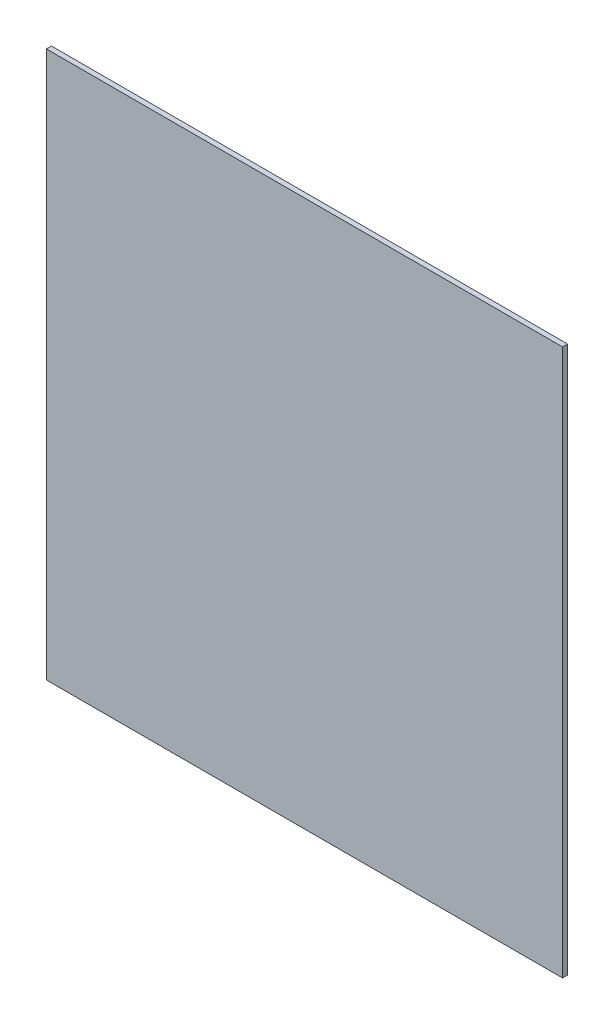
ISO-10303-21;
HEADER;
FILE_DESCRIPTION(('STEP AP214'),'2;1');
FILE_NAME('part.step','',(''),(''),'','','');
FILE_SCHEMA(('AUTOMOTIVE_DESIGN { 1 0 10303 214 1 1 1 1 }'));
ENDSEC;
DATA;
#1=APPLICATION_CONTEXT('core data for automotive mechanical design processes');
#2=APPLICATION_PROTOCOL_DEFINITION('international standard','automotive_design',2000,#1);
#3=PRODUCT_CONTEXT('',#1,'mechanical');
#4=PRODUCT('Part','Part','',(#3));
#5=PRODUCT_RELATED_PRODUCT_CATEGORY('part','',(#4));
#6=PRODUCT_DEFINITION_FORMATION('','',#4);
#7=PRODUCT_DEFINITION_CONTEXT('part definition',#1,'design');
#8=PRODUCT_DEFINITION('design','',#6,#7);
#9=PRODUCT_DEFINITION_SHAPE('','',#8);
#10=(LENGTH_UNIT() NAMED_UNIT(*) SI_UNIT(.MILLI.,.METRE.));
#11=(NAMED_UNIT(*) PLANE_ANGLE_UNIT() SI_UNIT($,.RADIAN.));
#12=(NAMED_UNIT(*) SI_UNIT($,.STERADIAN.) SOLID_ANGLE_UNIT());
#13=UNCERTAINTY_MEASURE_WITH_UNIT(LENGTH_MEASURE(1.E-05),#10,'distance_accuracy_value','');
#14=(GEOMETRIC_REPRESENTATION_CONTEXT(3) GLOBAL_UNCERTAINTY_ASSIGNED_CONTEXT((#13)) GLOBAL_UNIT_ASSIGNED_CONTEXT((#10,
#11,#12)) REPRESENTATION_CONTEXT('',''));
#15=CARTESIAN_POINT('',(0.,0.,0.));
#16=DIRECTION('',(0.,0.,1.));
#17=DIRECTION('',(1.,0.,0.));
#18=AXIS2_PLACEMENT_3D('',#15,#16,#17);
#19=CARTESIAN_POINT('',(606.,648.,6.));
#20=DIRECTION('',(-1.,0.,0.));
#21=DIRECTION('',(0.,0.,1.));
#22=AXIS2_PLACEMENT_3D('',#19,#20,#21);
#23=PLANE('',#22);
#24=DIRECTION('',(0.,1.,0.));
#25=VECTOR('',#24,1.);
#26=CARTESIAN_POINT('',(606.,648.,0.));
#27=LINE('',#26,#25);
#28=CARTESIAN_POINT('',(606.,0.,0.));
#29=VERTEX_POINT('',#28);
#30=CARTESIAN_POINT('',(606.,648.,0.));
#31=VERTEX_POINT('',#30);
#32=EDGE_CURVE('E96',#29,#31,#27,.T.);
#33=ORIENTED_EDGE('',*,*,#32,.T.);
#34=DIRECTION('',(0.,0.,-1.));
#35=VECTOR('',#34,1.);
#36=CARTESIAN_POINT('',(606.,648.,6.));
#37=LINE('',#36,#35);
#38=CARTESIAN_POINT('',(606.,648.,6.));
#39=VERTEX_POINT('',#38);
#40=EDGE_CURVE('E11',#39,#31,#37,.T.);
#41=ORIENTED_EDGE('',*,*,#40,.F.);
#42=DIRECTION('',(0.,1.,0.));
#43=VECTOR('',#42,1.);
#44=CARTESIAN_POINT('',(606.,648.,6.));
#45=LINE('',#44,#43);
#46=CARTESIAN_POINT('',(606.,0.,6.));
#47=VERTEX_POINT('',#46);
#48=EDGE_CURVE('E84',#47,#39,#45,.T.);
#49=ORIENTED_EDGE('',*,*,#48,.F.);
#50=DIRECTION('',(0.,0.,-1.));
#51=VECTOR('',#50,1.);
#52=CARTESIAN_POINT('',(606.,0.,6.));
#53=LINE('',#52,#51);
#54=EDGE_CURVE('E92',#47,#29,#53,.T.);
#55=ORIENTED_EDGE('',*,*,#54,.T.);
#56=EDGE_LOOP('',(#33,#41,#49,#55));
#57=FACE_BOUND('',#56,.T.);
#58=ADVANCED_FACE('F33',(#57),#23,.F.);
#59=CARTESIAN_POINT('',(606.,648.,6.));
#60=DIRECTION('',(0.,-1.,0.));
#61=DIRECTION('',(1.,0.,0.));
#62=AXIS2_PLACEMENT_3D('',#59,#60,#61);
#63=PLANE('',#62);
#64=DIRECTION('',(-1.,0.,0.));
#65=VECTOR('',#64,1.);
#66=CARTESIAN_POINT('',(606.,648.,0.));
#67=LINE('',#66,#65);
#68=CARTESIAN_POINT('',(-6.,648.,0.));
#69=VERTEX_POINT('',#68);
#70=EDGE_CURVE('E88',#31,#69,#67,.T.);
#71=ORIENTED_EDGE('',*,*,#70,.T.);
#72=DIRECTION('',(0.,0.,-1.));
#73=VECTOR('',#72,1.);
#74=CARTESIAN_POINT('',(-6.,648.,6.));
#75=LINE('',#74,#73);
#76=CARTESIAN_POINT('',(-6.,648.,6.));
#77=VERTEX_POINT('',#76);
#78=EDGE_CURVE('E41',#77,#69,#75,.T.);
#79=ORIENTED_EDGE('',*,*,#78,.F.);
#80=DIRECTION('',(-1.,0.,0.));
#81=VECTOR('',#80,1.);
#82=CARTESIAN_POINT('',(606.,648.,6.));
#83=LINE('',#82,#81);
#84=EDGE_CURVE('E79',#39,#77,#83,.T.);
#85=ORIENTED_EDGE('',*,*,#84,.F.);
#86=ORIENTED_EDGE('',*,*,#40,.T.);
#87=EDGE_LOOP('',(#71,#79,#85,#86));
#88=FACE_BOUND('',#87,.T.);
#89=ADVANCED_FACE('F87',(#88),#63,.F.);
#90=CARTESIAN_POINT('',(-6.,648.,6.));
#91=DIRECTION('',(1.,0.,0.));
#92=DIRECTION('',(0.,1.,0.));
#93=AXIS2_PLACEMENT_3D('',#90,#91,#92);
#94=PLANE('',#93);
#95=DIRECTION('',(0.,-1.,0.));
#96=VECTOR('',#95,1.);
#97=CARTESIAN_POINT('',(-6.,648.,0.));
#98=LINE('',#97,#96);
#99=CARTESIAN_POINT('',(-6.,0.,0.));
#100=VERTEX_POINT('',#99);
#101=EDGE_CURVE('E66',#69,#100,#98,.T.);
#102=ORIENTED_EDGE('',*,*,#101,.T.);
#103=DIRECTION('',(0.,0.,-1.));
#104=VECTOR('',#103,1.);
#105=CARTESIAN_POINT('',(-6.,0.,6.));
#106=LINE('',#105,#104);
#107=CARTESIAN_POINT('',(-6.,0.,6.));
#108=VERTEX_POINT('',#107);
#109=EDGE_CURVE('E89',#108,#100,#106,.T.);
#110=ORIENTED_EDGE('',*,*,#109,.F.);
#111=DIRECTION('',(0.,-1.,0.));
#112=VECTOR('',#111,1.);
#113=CARTESIAN_POINT('',(-6.,648.,6.));
#114=LINE('',#113,#112);
#115=EDGE_CURVE('E82',#77,#108,#114,.T.);
#116=ORIENTED_EDGE('',*,*,#115,.F.);
#117=ORIENTED_EDGE('',*,*,#78,.T.);
#118=EDGE_LOOP('',(#102,#110,#116,#117));
#119=FACE_BOUND('',#118,.T.);
#120=ADVANCED_FACE('F90',(#119),#94,.F.);
#121=CARTESIAN_POINT('',(606.,0.,6.));
#122=DIRECTION('',(0.,1.,0.));
#123=DIRECTION('',(0.,0.,1.));
#124=AXIS2_PLACEMENT_3D('',#121,#122,#123);
#125=PLANE('',#124);
#126=DIRECTION('',(1.,0.,0.));
#127=VECTOR('',#126,1.);
#128=CARTESIAN_POINT('',(606.,0.,0.));
#129=LINE('',#128,#127);
#130=EDGE_CURVE('E72',#100,#29,#129,.T.);
#131=ORIENTED_EDGE('',*,*,#130,.T.);
#132=ORIENTED_EDGE('',*,*,#54,.F.);
#133=DIRECTION('',(1.,0.,0.));
#134=VECTOR('',#133,1.);
#135=CARTESIAN_POINT('',(606.,0.,6.));
#136=LINE('',#135,#134);
#137=EDGE_CURVE('E49',#108,#47,#136,.T.);
#138=ORIENTED_EDGE('',*,*,#137,.F.);
#139=ORIENTED_EDGE('',*,*,#109,.T.);
#140=EDGE_LOOP('',(#131,#132,#138,#139));
#141=FACE_BOUND('',#140,.T.);
#142=ADVANCED_FACE('F103',(#141),#125,.F.);
#143=CARTESIAN_POINT('',(0.,0.,6.));
#144=DIRECTION('',(0.,0.,-1.));
#145=DIRECTION('',(-1.,0.,0.));
#146=AXIS2_PLACEMENT_3D('',#143,#144,#145);
#147=PLANE('',#146);
#148=ORIENTED_EDGE('',*,*,#48,.T.);
#149=ORIENTED_EDGE('',*,*,#84,.T.);
#150=ORIENTED_EDGE('',*,*,#115,.T.);
#151=ORIENTED_EDGE('',*,*,#137,.T.);
#152=EDGE_LOOP('',(#148,#149,#150,#151));
#153=FACE_BOUND('',#152,.T.);
#154=ADVANCED_FACE('F80',(#153),#147,.F.);
#155=CARTESIAN_POINT('',(0.,0.,0.));
#156=DIRECTION('',(0.,0.,-1.));
#157=DIRECTION('',(-1.,0.,0.));
#158=AXIS2_PLACEMENT_3D('',#155,#156,#157);
#159=PLANE('',#158);
#160=ORIENTED_EDGE('',*,*,#32,.F.);
#161=ORIENTED_EDGE('',*,*,#130,.F.);
#162=ORIENTED_EDGE('',*,*,#101,.F.);
#163=ORIENTED_EDGE('',*,*,#70,.F.);
#164=EDGE_LOOP('',(#160,#161,#162,#163));
#165=FACE_BOUND('',#164,.T.);
#166=ADVANCED_FACE('F106',(#165),#159,.T.);
#167=CLOSED_SHELL('',(#58,#89,#120,#142,#154,#166));
#168=MANIFOLD_SOLID_BREP('B2',#167);
#169=ADVANCED_BREP_SHAPE_REPRESENTATION('',(#18,#168),#14);
#170=SHAPE_DEFINITION_REPRESENTATION(#9,#169);
ENDSEC;
END-ISO-10303-21;
